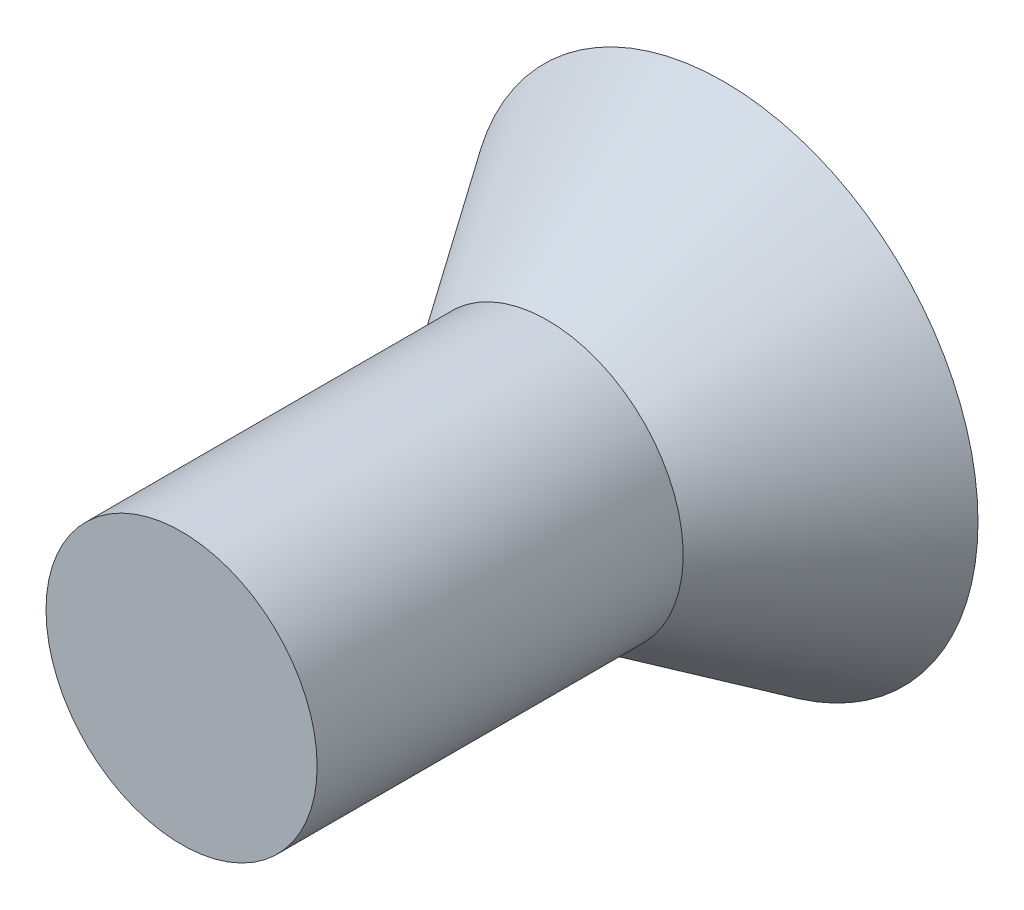
ISO-10303-21;
HEADER;
FILE_DESCRIPTION(('STEP AP214'),'2;1');
FILE_NAME('part.step','',(''),(''),'','','');
FILE_SCHEMA(('AUTOMOTIVE_DESIGN { 1 0 10303 214 1 1 1 1 }'));
ENDSEC;
DATA;
#1=APPLICATION_CONTEXT('core data for automotive mechanical design processes');
#2=APPLICATION_PROTOCOL_DEFINITION('international standard','automotive_design',2000,#1);
#3=PRODUCT_CONTEXT('',#1,'mechanical');
#4=PRODUCT('Part','Part','',(#3));
#5=PRODUCT_RELATED_PRODUCT_CATEGORY('part','',(#4));
#6=PRODUCT_DEFINITION_FORMATION('','',#4);
#7=PRODUCT_DEFINITION_CONTEXT('part definition',#1,'design');
#8=PRODUCT_DEFINITION('design','',#6,#7);
#9=PRODUCT_DEFINITION_SHAPE('','',#8);
#10=(LENGTH_UNIT() NAMED_UNIT(*) SI_UNIT(.MILLI.,.METRE.));
#11=(NAMED_UNIT(*) PLANE_ANGLE_UNIT() SI_UNIT($,.RADIAN.));
#12=(NAMED_UNIT(*) SI_UNIT($,.STERADIAN.) SOLID_ANGLE_UNIT());
#13=UNCERTAINTY_MEASURE_WITH_UNIT(LENGTH_MEASURE(1.E-05),#10,'distance_accuracy_value','');
#14=(GEOMETRIC_REPRESENTATION_CONTEXT(3) GLOBAL_UNCERTAINTY_ASSIGNED_CONTEXT((#13)) GLOBAL_UNIT_ASSIGNED_CONTEXT((#10,
#11,#12)) REPRESENTATION_CONTEXT('',''));
#15=CARTESIAN_POINT('',(0.,0.,0.));
#16=DIRECTION('',(0.,0.,1.));
#17=DIRECTION('',(1.,0.,0.));
#18=AXIS2_PLACEMENT_3D('',#15,#16,#17);
#19=CARTESIAN_POINT('',(0.,0.,8.));
#20=DIRECTION('',(0.,0.,-1.));
#21=DIRECTION('',(-1.,0.,0.));
#22=AXIS2_PLACEMENT_3D('',#19,#20,#21);
#23=CYLINDRICAL_SURFACE('',#22,2.);
#24=CARTESIAN_POINT('',(0.,0.,8.));
#25=DIRECTION('',(0.,0.,1.));
#26=DIRECTION('',(1.,0.,0.));
#27=AXIS2_PLACEMENT_3D('',#24,#25,#26);
#28=CIRCLE('',#27,2.);
#29=CARTESIAN_POINT('',(2.,0.,8.));
#30=VERTEX_POINT('',#29);
#31=EDGE_CURVE('E44',#30,#30,#28,.T.);
#32=ORIENTED_EDGE('',*,*,#31,.F.);
#33=EDGE_LOOP('',(#32));
#34=FACE_BOUND('',#33,.T.);
#35=CARTESIAN_POINT('',(0.,0.,2.6));
#36=DIRECTION('',(0.,0.,-1.));
#37=DIRECTION('',(-1.,0.,0.));
#38=AXIS2_PLACEMENT_3D('',#35,#36,#37);
#39=CIRCLE('',#38,2.);
#40=CARTESIAN_POINT('',(-2.,0.,2.6));
#41=VERTEX_POINT('',#40);
#42=EDGE_CURVE('E10',#41,#41,#39,.T.);
#43=ORIENTED_EDGE('',*,*,#42,.F.);
#44=EDGE_LOOP('',(#43));
#45=FACE_BOUND('',#44,.T.);
#46=ADVANCED_FACE('F37',(#34,#45),#23,.T.);
#47=CARTESIAN_POINT('',(0.,0.,8.));
#48=DIRECTION('',(0.,0.,1.));
#49=DIRECTION('',(1.,0.,0.));
#50=AXIS2_PLACEMENT_3D('',#47,#48,#49);
#51=PLANE('',#50);
#52=ORIENTED_EDGE('',*,*,#31,.T.);
#53=EDGE_LOOP('',(#52));
#54=FACE_BOUND('',#53,.T.);
#55=ADVANCED_FACE('F61',(#54),#51,.T.);
#56=CARTESIAN_POINT('',(0.,0.,2.6));
#57=DIRECTION('',(0.,0.,-1.));
#58=DIRECTION('',(-1.,0.,0.));
#59=AXIS2_PLACEMENT_3D('',#56,#57,#58);
#60=CONICAL_SURFACE('',#59,2.,0.592427353431879);
#61=CARTESIAN_POINT('',(0.,0.,0.));
#62=DIRECTION('',(0.,0.,-1.));
#63=DIRECTION('',(-1.,0.,0.));
#64=AXIS2_PLACEMENT_3D('',#61,#62,#63);
#65=CIRCLE('',#64,3.75);
#66=CARTESIAN_POINT('',(-3.75,0.,0.));
#67=VERTEX_POINT('',#66);
#68=EDGE_CURVE('E49',#67,#67,#65,.T.);
#69=ORIENTED_EDGE('',*,*,#68,.F.);
#70=EDGE_LOOP('',(#69));
#71=FACE_BOUND('',#70,.T.);
#72=ORIENTED_EDGE('',*,*,#42,.T.);
#73=EDGE_LOOP('',(#72));
#74=FACE_BOUND('',#73,.T.);
#75=ADVANCED_FACE('F59',(#71,#74),#60,.T.);
#76=CARTESIAN_POINT('',(0.,0.,0.));
#77=DIRECTION('',(0.,0.,1.));
#78=DIRECTION('',(1.,0.,0.));
#79=AXIS2_PLACEMENT_3D('',#76,#77,#78);
#80=PLANE('',#79);
#81=ORIENTED_EDGE('',*,*,#68,.T.);
#82=EDGE_LOOP('',(#81));
#83=FACE_BOUND('',#82,.T.);
#84=ADVANCED_FACE('F57',(#83),#80,.F.);
#85=CLOSED_SHELL('',(#46,#55,#75,#84));
#86=MANIFOLD_SOLID_BREP('B2',#85);
#87=ADVANCED_BREP_SHAPE_REPRESENTATION('',(#18,#86),#14);
#88=SHAPE_DEFINITION_REPRESENTATION(#9,#87);
ENDSEC;
END-ISO-10303-21;
